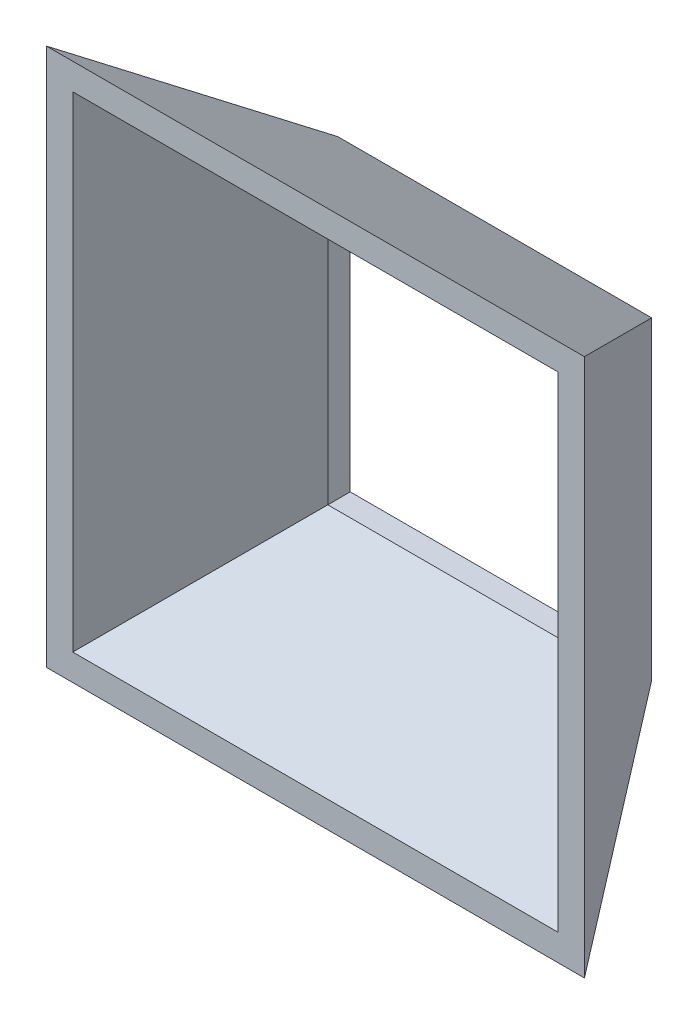
ISO-10303-21;
HEADER;
FILE_DESCRIPTION(('STEP AP214'),'2;1');
FILE_NAME('part.step','',(''),(''),'','','');
FILE_SCHEMA(('AUTOMOTIVE_DESIGN { 1 0 10303 214 1 1 1 1 }'));
ENDSEC;
DATA;
#1=APPLICATION_CONTEXT('core data for automotive mechanical design processes');
#2=APPLICATION_PROTOCOL_DEFINITION('international standard','automotive_design',2000,#1);
#3=PRODUCT_CONTEXT('',#1,'mechanical');
#4=PRODUCT('Part','Part','',(#3));
#5=PRODUCT_RELATED_PRODUCT_CATEGORY('part','',(#4));
#6=PRODUCT_DEFINITION_FORMATION('','',#4);
#7=PRODUCT_DEFINITION_CONTEXT('part definition',#1,'design');
#8=PRODUCT_DEFINITION('design','',#6,#7);
#9=PRODUCT_DEFINITION_SHAPE('','',#8);
#10=(LENGTH_UNIT() NAMED_UNIT(*) SI_UNIT(.MILLI.,.METRE.));
#11=(NAMED_UNIT(*) PLANE_ANGLE_UNIT() SI_UNIT($,.RADIAN.));
#12=(NAMED_UNIT(*) SI_UNIT($,.STERADIAN.) SOLID_ANGLE_UNIT());
#13=UNCERTAINTY_MEASURE_WITH_UNIT(LENGTH_MEASURE(1.E-05),#10,'distance_accuracy_value','');
#14=(GEOMETRIC_REPRESENTATION_CONTEXT(3) GLOBAL_UNCERTAINTY_ASSIGNED_CONTEXT((#13)) GLOBAL_UNIT_ASSIGNED_CONTEXT((#10,
#11,#12)) REPRESENTATION_CONTEXT('',''));
#15=CARTESIAN_POINT('',(0.,0.,0.));
#16=DIRECTION('',(0.,0.,1.));
#17=DIRECTION('',(1.,0.,0.));
#18=AXIS2_PLACEMENT_3D('',#15,#16,#17);
#19=CARTESIAN_POINT('',(0.,0.,50.8));
#20=DIRECTION('',(0.,0.,1.));
#21=DIRECTION('',(1.,0.,0.));
#22=AXIS2_PLACEMENT_3D('',#19,#20,#21);
#23=PLANE('',#22);
#24=DIRECTION('',(0.,-1.,0.));
#25=VECTOR('',#24,1.);
#26=CARTESIAN_POINT('',(-68.7117774764301,0.,50.8));
#27=LINE('',#26,#25);
#28=CARTESIAN_POINT('',(-68.7117774764301,68.7117774764301,50.8));
#29=VERTEX_POINT('',#28);
#30=CARTESIAN_POINT('',(-68.7117774764301,-68.7117774764301,50.8));
#31=VERTEX_POINT('',#30);
#32=EDGE_CURVE('E150',#29,#31,#27,.T.);
#33=ORIENTED_EDGE('',*,*,#32,.F.);
#34=DIRECTION('',(-1.,0.,0.));
#35=VECTOR('',#34,1.);
#36=CARTESIAN_POINT('',(0.,68.7117774764301,50.8));
#37=LINE('',#36,#35);
#38=CARTESIAN_POINT('',(68.7117774764301,68.7117774764301,50.8));
#39=VERTEX_POINT('',#38);
#40=EDGE_CURVE('E158',#39,#29,#37,.T.);
#41=ORIENTED_EDGE('',*,*,#40,.F.);
#42=DIRECTION('',(0.,1.,0.));
#43=VECTOR('',#42,1.);
#44=CARTESIAN_POINT('',(68.7117774764301,0.,50.8));
#45=LINE('',#44,#43);
#46=CARTESIAN_POINT('',(68.7117774764301,-68.71177747643,50.8));
#47=VERTEX_POINT('',#46);
#48=EDGE_CURVE('E66',#47,#39,#45,.T.);
#49=ORIENTED_EDGE('',*,*,#48,.F.);
#50=DIRECTION('',(1.,0.,0.));
#51=VECTOR('',#50,1.);
#52=CARTESIAN_POINT('',(0.,-68.71177747643,50.8));
#53=LINE('',#52,#51);
#54=EDGE_CURVE('E162',#31,#47,#53,.T.);
#55=ORIENTED_EDGE('',*,*,#54,.F.);
#56=EDGE_LOOP('',(#33,#41,#49,#55));
#57=FACE_BOUND('',#56,.T.);
#58=DIRECTION('',(0.,-1.,0.));
#59=VECTOR('',#58,1.);
#60=CARTESIAN_POINT('',(-76.2,76.2,50.8));
#61=LINE('',#60,#59);
#62=CARTESIAN_POINT('',(-76.2,76.2,50.8));
#63=VERTEX_POINT('',#62);
#64=CARTESIAN_POINT('',(-76.2,-76.1999999999999,50.8));
#65=VERTEX_POINT('',#64);
#66=EDGE_CURVE('E212',#63,#65,#61,.T.);
#67=ORIENTED_EDGE('',*,*,#66,.T.);
#68=DIRECTION('',(1.,0.,0.));
#69=VECTOR('',#68,1.);
#70=CARTESIAN_POINT('',(-76.2,-76.2,50.8));
#71=LINE('',#70,#69);
#72=CARTESIAN_POINT('',(76.2,-76.2,50.8));
#73=VERTEX_POINT('',#72);
#74=EDGE_CURVE('E326',#65,#73,#71,.T.);
#75=ORIENTED_EDGE('',*,*,#74,.T.);
#76=DIRECTION('',(0.,1.,0.));
#77=VECTOR('',#76,1.);
#78=CARTESIAN_POINT('',(76.2,76.2,50.8));
#79=LINE('',#78,#77);
#80=CARTESIAN_POINT('',(76.2,76.2,50.8));
#81=VERTEX_POINT('',#80);
#82=EDGE_CURVE('E323',#73,#81,#79,.T.);
#83=ORIENTED_EDGE('',*,*,#82,.T.);
#84=DIRECTION('',(-1.,0.,0.));
#85=VECTOR('',#84,1.);
#86=CARTESIAN_POINT('',(-76.2,76.2,50.8));
#87=LINE('',#86,#85);
#88=EDGE_CURVE('E276',#81,#63,#87,.T.);
#89=ORIENTED_EDGE('',*,*,#88,.T.);
#90=EDGE_LOOP('',(#67,#75,#83,#89));
#91=FACE_BOUND('',#90,.T.);
#92=ADVANCED_FACE('F43',(#57,#91),#23,.T.);
#93=CARTESIAN_POINT('',(0.,0.,0.));
#94=DIRECTION('',(0.,0.,1.));
#95=DIRECTION('',(1.,0.,0.));
#96=AXIS2_PLACEMENT_3D('',#93,#94,#95);
#97=PLANE('',#96);
#98=DIRECTION('',(-1.,0.,0.));
#99=VECTOR('',#98,1.);
#100=CARTESIAN_POINT('',(0.,40.9305274764301,0.));
#101=LINE('',#100,#99);
#102=CARTESIAN_POINT('',(40.9305274764301,40.9305274764301,0.));
#103=VERTEX_POINT('',#102);
#104=CARTESIAN_POINT('',(-40.9305274764301,40.9305274764301,0.));
#105=VERTEX_POINT('',#104);
#106=EDGE_CURVE('E51',#103,#105,#101,.T.);
#107=ORIENTED_EDGE('',*,*,#106,.T.);
#108=DIRECTION('',(0.,-1.,0.));
#109=VECTOR('',#108,1.);
#110=CARTESIAN_POINT('',(-40.9305274764301,0.,0.));
#111=LINE('',#110,#109);
#112=CARTESIAN_POINT('',(-40.9305274764301,-40.9305274764301,0.));
#113=VERTEX_POINT('',#112);
#114=EDGE_CURVE('E12',#105,#113,#111,.T.);
#115=ORIENTED_EDGE('',*,*,#114,.T.);
#116=DIRECTION('',(1.,0.,0.));
#117=VECTOR('',#116,1.);
#118=CARTESIAN_POINT('',(0.,-40.9305274764301,0.));
#119=LINE('',#118,#117);
#120=CARTESIAN_POINT('',(40.9305274764301,-40.9305274764301,0.));
#121=VERTEX_POINT('',#120);
#122=EDGE_CURVE('E126',#113,#121,#119,.T.);
#123=ORIENTED_EDGE('',*,*,#122,.T.);
#124=DIRECTION('',(0.,1.,0.));
#125=VECTOR('',#124,1.);
#126=CARTESIAN_POINT('',(40.9305274764301,0.,0.));
#127=LINE('',#126,#125);
#128=EDGE_CURVE('E349',#121,#103,#127,.T.);
#129=ORIENTED_EDGE('',*,*,#128,.T.);
#130=EDGE_LOOP('',(#107,#115,#123,#129));
#131=FACE_BOUND('',#130,.T.);
#132=DIRECTION('',(0.,-1.,0.));
#133=VECTOR('',#132,1.);
#134=CARTESIAN_POINT('',(-44.45,44.45,0.));
#135=LINE('',#134,#133);
#136=CARTESIAN_POINT('',(-44.45,44.45,0.));
#137=VERTEX_POINT('',#136);
#138=CARTESIAN_POINT('',(-44.45,-44.45,0.));
#139=VERTEX_POINT('',#138);
#140=EDGE_CURVE('E160',#137,#139,#135,.T.);
#141=ORIENTED_EDGE('',*,*,#140,.F.);
#142=DIRECTION('',(-1.,0.,0.));
#143=VECTOR('',#142,1.);
#144=CARTESIAN_POINT('',(-44.45,44.45,0.));
#145=LINE('',#144,#143);
#146=CARTESIAN_POINT('',(44.45,44.45,0.));
#147=VERTEX_POINT('',#146);
#148=EDGE_CURVE('E170',#147,#137,#145,.T.);
#149=ORIENTED_EDGE('',*,*,#148,.F.);
#150=DIRECTION('',(0.,1.,0.));
#151=VECTOR('',#150,1.);
#152=CARTESIAN_POINT('',(44.45,44.45,0.));
#153=LINE('',#152,#151);
#154=CARTESIAN_POINT('',(44.45,-44.45,0.));
#155=VERTEX_POINT('',#154);
#156=EDGE_CURVE('E265',#155,#147,#153,.T.);
#157=ORIENTED_EDGE('',*,*,#156,.F.);
#158=DIRECTION('',(1.,0.,0.));
#159=VECTOR('',#158,1.);
#160=CARTESIAN_POINT('',(-44.45,-44.45,0.));
#161=LINE('',#160,#159);
#162=EDGE_CURVE('E250',#139,#155,#161,.T.);
#163=ORIENTED_EDGE('',*,*,#162,.F.);
#164=EDGE_LOOP('',(#141,#149,#157,#163));
#165=FACE_BOUND('',#164,.T.);
#166=ADVANCED_FACE('F189',(#131,#165),#97,.F.);
#167=CARTESIAN_POINT('',(0.,31.9640449438202,-19.9775280898876));
#168=DIRECTION('',(0.,-0.847998304005088,0.52999894000318));
#169=DIRECTION('',(0.,-0.52999894000318,-0.847998304005088));
#170=AXIS2_PLACEMENT_3D('',#167,#168,#169);
#171=PLANE('',#170);
#172=DIRECTION('',(-0.468292905790847,0.468292905790847,0.749268649265355));
#173=VECTOR('',#172,1.);
#174=CARTESIAN_POINT('',(-44.45,44.45,0.));
#175=LINE('',#174,#173);
#176=EDGE_CURVE('E278',#137,#63,#175,.T.);
#177=ORIENTED_EDGE('',*,*,#176,.T.);
#178=ORIENTED_EDGE('',*,*,#88,.F.);
#179=DIRECTION('',(0.468292905790847,0.468292905790847,0.749268649265355));
#180=VECTOR('',#179,1.);
#181=CARTESIAN_POINT('',(44.45,44.45,0.));
#182=LINE('',#181,#180);
#183=EDGE_CURVE('E176',#147,#81,#182,.T.);
#184=ORIENTED_EDGE('',*,*,#183,.F.);
#185=ORIENTED_EDGE('',*,*,#148,.T.);
#186=EDGE_LOOP('',(#177,#178,#184,#185));
#187=FACE_BOUND('',#186,.T.);
#188=ADVANCED_FACE('F178',(#187),#171,.F.);
#189=CARTESIAN_POINT('',(31.9640449438202,0.,-19.9775280898877));
#190=DIRECTION('',(-0.847998304005088,0.,0.52999894000318));
#191=DIRECTION('',(0.52999894000318,0.,0.847998304005088));
#192=AXIS2_PLACEMENT_3D('',#189,#190,#191);
#193=PLANE('',#192);
#194=ORIENTED_EDGE('',*,*,#183,.T.);
#195=ORIENTED_EDGE('',*,*,#82,.F.);
#196=DIRECTION('',(0.468292905790847,-0.468292905790847,0.749268649265355));
#197=VECTOR('',#196,1.);
#198=CARTESIAN_POINT('',(44.45,-44.45,0.));
#199=LINE('',#198,#197);
#200=EDGE_CURVE('E242',#155,#73,#199,.T.);
#201=ORIENTED_EDGE('',*,*,#200,.F.);
#202=ORIENTED_EDGE('',*,*,#156,.T.);
#203=EDGE_LOOP('',(#194,#195,#201,#202));
#204=FACE_BOUND('',#203,.T.);
#205=ADVANCED_FACE('F188',(#204),#193,.F.);
#206=CARTESIAN_POINT('',(-31.9640449438202,0.,-19.9775280898876));
#207=DIRECTION('',(0.847998304005088,0.,0.52999894000318));
#208=DIRECTION('',(0.52999894000318,0.,-0.847998304005088));
#209=AXIS2_PLACEMENT_3D('',#206,#207,#208);
#210=PLANE('',#209);
#211=DIRECTION('',(-0.468292905790847,-0.468292905790847,0.749268649265355));
#212=VECTOR('',#211,1.);
#213=CARTESIAN_POINT('',(-44.45,-44.45,0.));
#214=LINE('',#213,#212);
#215=EDGE_CURVE('E235',#139,#65,#214,.T.);
#216=ORIENTED_EDGE('',*,*,#215,.T.);
#217=ORIENTED_EDGE('',*,*,#66,.F.);
#218=ORIENTED_EDGE('',*,*,#176,.F.);
#219=ORIENTED_EDGE('',*,*,#140,.T.);
#220=EDGE_LOOP('',(#216,#217,#218,#219));
#221=FACE_BOUND('',#220,.T.);
#222=ADVANCED_FACE('F217',(#221),#210,.F.);
#223=CARTESIAN_POINT('',(0.,-31.9640449438202,-19.9775280898876));
#224=DIRECTION('',(0.,0.847998304005088,0.52999894000318));
#225=DIRECTION('',(0.,-0.52999894000318,0.847998304005088));
#226=AXIS2_PLACEMENT_3D('',#223,#224,#225);
#227=PLANE('',#226);
#228=ORIENTED_EDGE('',*,*,#200,.T.);
#229=ORIENTED_EDGE('',*,*,#74,.F.);
#230=ORIENTED_EDGE('',*,*,#215,.F.);
#231=ORIENTED_EDGE('',*,*,#162,.T.);
#232=EDGE_LOOP('',(#228,#229,#230,#231));
#233=FACE_BOUND('',#232,.T.);
#234=ADVANCED_FACE('F225',(#233),#227,.F.);
#235=CARTESIAN_POINT('',(0.,26.5792557133879,-16.6120348208674));
#236=DIRECTION('',(0.,-0.847998304005088,0.52999894000318));
#237=DIRECTION('',(0.,-0.52999894000318,-0.847998304005088));
#238=AXIS2_PLACEMENT_3D('',#235,#236,#237);
#239=PLANE('',#238);
#240=DIRECTION('',(-0.468292905790847,0.468292905790847,0.749268649265355));
#241=VECTOR('',#240,1.);
#242=CARTESIAN_POINT('',(-20.7504715657151,20.7504715657151,-25.9380894571439));
#243=LINE('',#242,#241);
#244=CARTESIAN_POINT('',(-40.9305274764301,40.9305274764301,6.35));
#245=VERTEX_POINT('',#244);
#246=EDGE_CURVE('E155',#245,#29,#243,.T.);
#247=ORIENTED_EDGE('',*,*,#246,.F.);
#248=DIRECTION('',(-1.,0.,0.));
#249=VECTOR('',#248,1.);
#250=CARTESIAN_POINT('',(0.,40.9305274764301,6.35));
#251=LINE('',#250,#249);
#252=CARTESIAN_POINT('',(40.9305274764301,40.9305274764301,6.35));
#253=VERTEX_POINT('',#252);
#254=EDGE_CURVE('E365',#253,#245,#251,.T.);
#255=ORIENTED_EDGE('',*,*,#254,.F.);
#256=DIRECTION('',(0.468292905790847,0.468292905790847,0.749268649265355));
#257=VECTOR('',#256,1.);
#258=CARTESIAN_POINT('',(20.7504715657151,20.7504715657151,-25.9380894571439));
#259=LINE('',#258,#257);
#260=EDGE_CURVE('E152',#253,#39,#259,.T.);
#261=ORIENTED_EDGE('',*,*,#260,.T.);
#262=ORIENTED_EDGE('',*,*,#40,.T.);
#263=EDGE_LOOP('',(#247,#255,#261,#262));
#264=FACE_BOUND('',#263,.T.);
#265=ADVANCED_FACE('F372',(#264),#239,.T.);
#266=CARTESIAN_POINT('',(26.5792557133879,0.,-16.6120348208675));
#267=DIRECTION('',(-0.847998304005088,0.,0.52999894000318));
#268=DIRECTION('',(0.52999894000318,0.,0.847998304005088));
#269=AXIS2_PLACEMENT_3D('',#266,#267,#268);
#270=PLANE('',#269);
#271=ORIENTED_EDGE('',*,*,#260,.F.);
#272=DIRECTION('',(0.,1.,0.));
#273=VECTOR('',#272,1.);
#274=CARTESIAN_POINT('',(40.9305274764301,0.,6.35));
#275=LINE('',#274,#273);
#276=CARTESIAN_POINT('',(40.9305274764301,-40.9305274764301,6.35));
#277=VERTEX_POINT('',#276);
#278=EDGE_CURVE('E146',#277,#253,#275,.T.);
#279=ORIENTED_EDGE('',*,*,#278,.F.);
#280=DIRECTION('',(0.468292905790847,-0.468292905790847,0.749268649265355));
#281=VECTOR('',#280,1.);
#282=CARTESIAN_POINT('',(20.7504715657151,-20.7504715657151,-25.9380894571439));
#283=LINE('',#282,#281);
#284=EDGE_CURVE('E145',#277,#47,#283,.T.);
#285=ORIENTED_EDGE('',*,*,#284,.T.);
#286=ORIENTED_EDGE('',*,*,#48,.T.);
#287=EDGE_LOOP('',(#271,#279,#285,#286));
#288=FACE_BOUND('',#287,.T.);
#289=ADVANCED_FACE('F373',(#288),#270,.T.);
#290=CARTESIAN_POINT('',(-26.5792557133879,0.,-16.6120348208674));
#291=DIRECTION('',(0.847998304005088,0.,0.52999894000318));
#292=DIRECTION('',(0.52999894000318,0.,-0.847998304005088));
#293=AXIS2_PLACEMENT_3D('',#290,#291,#292);
#294=PLANE('',#293);
#295=DIRECTION('',(-0.468292905790847,-0.468292905790847,0.749268649265355));
#296=VECTOR('',#295,1.);
#297=CARTESIAN_POINT('',(-20.7504715657151,-20.7504715657151,-25.9380894571439));
#298=LINE('',#297,#296);
#299=CARTESIAN_POINT('',(-40.9305274764301,-40.9305274764301,6.35));
#300=VERTEX_POINT('',#299);
#301=EDGE_CURVE('E143',#300,#31,#298,.T.);
#302=ORIENTED_EDGE('',*,*,#301,.F.);
#303=DIRECTION('',(0.,-1.,0.));
#304=VECTOR('',#303,1.);
#305=CARTESIAN_POINT('',(-40.9305274764301,0.,6.35));
#306=LINE('',#305,#304);
#307=EDGE_CURVE('E130',#245,#300,#306,.T.);
#308=ORIENTED_EDGE('',*,*,#307,.F.);
#309=ORIENTED_EDGE('',*,*,#246,.T.);
#310=ORIENTED_EDGE('',*,*,#32,.T.);
#311=EDGE_LOOP('',(#302,#308,#309,#310));
#312=FACE_BOUND('',#311,.T.);
#313=ADVANCED_FACE('F148',(#312),#294,.T.);
#314=CARTESIAN_POINT('',(0.,-26.5792557133879,-16.6120348208674));
#315=DIRECTION('',(0.,0.847998304005088,0.52999894000318));
#316=DIRECTION('',(0.,-0.52999894000318,0.847998304005088));
#317=AXIS2_PLACEMENT_3D('',#314,#315,#316);
#318=PLANE('',#317);
#319=ORIENTED_EDGE('',*,*,#284,.F.);
#320=DIRECTION('',(1.,0.,0.));
#321=VECTOR('',#320,1.);
#322=CARTESIAN_POINT('',(0.,-40.9305274764301,6.35));
#323=LINE('',#322,#321);
#324=EDGE_CURVE('E123',#300,#277,#323,.T.);
#325=ORIENTED_EDGE('',*,*,#324,.F.);
#326=ORIENTED_EDGE('',*,*,#301,.T.);
#327=ORIENTED_EDGE('',*,*,#54,.T.);
#328=EDGE_LOOP('',(#319,#325,#326,#327));
#329=FACE_BOUND('',#328,.T.);
#330=ADVANCED_FACE('F141',(#329),#318,.T.);
#331=CARTESIAN_POINT('',(-40.9305274764301,-40.9305274764301,-0.000100000000003743));
#332=DIRECTION('',(-1.,0.,0.));
#333=DIRECTION('',(0.,0.,1.));
#334=AXIS2_PLACEMENT_3D('',#331,#332,#333);
#335=PLANE('',#334);
#336=DIRECTION('',(0.,0.,1.));
#337=VECTOR('',#336,1.);
#338=CARTESIAN_POINT('',(-40.9305274764301,40.9305274764301,-0.000100000000003743));
#339=LINE('',#338,#337);
#340=EDGE_CURVE('E133',#105,#245,#339,.T.);
#341=ORIENTED_EDGE('',*,*,#340,.T.);
#342=ORIENTED_EDGE('',*,*,#307,.T.);
#343=DIRECTION('',(0.,0.,1.));
#344=VECTOR('',#343,1.);
#345=CARTESIAN_POINT('',(-40.9305274764301,-40.9305274764301,-0.000100000000003743));
#346=LINE('',#345,#344);
#347=EDGE_CURVE('E119',#113,#300,#346,.T.);
#348=ORIENTED_EDGE('',*,*,#347,.F.);
#349=ORIENTED_EDGE('',*,*,#114,.F.);
#350=EDGE_LOOP('',(#341,#342,#348,#349));
#351=FACE_BOUND('',#350,.T.);
#352=ADVANCED_FACE('F131',(#351),#335,.F.);
#353=CARTESIAN_POINT('',(-40.9305274764301,40.9305274764301,-0.000100000000003743));
#354=DIRECTION('',(0.,1.,0.));
#355=DIRECTION('',(0.,0.,1.));
#356=AXIS2_PLACEMENT_3D('',#353,#354,#355);
#357=PLANE('',#356);
#358=DIRECTION('',(0.,0.,1.));
#359=VECTOR('',#358,1.);
#360=CARTESIAN_POINT('',(40.9305274764301,40.9305274764301,-0.000100000000003743));
#361=LINE('',#360,#359);
#362=EDGE_CURVE('E357',#103,#253,#361,.T.);
#363=ORIENTED_EDGE('',*,*,#362,.T.);
#364=ORIENTED_EDGE('',*,*,#254,.T.);
#365=ORIENTED_EDGE('',*,*,#340,.F.);
#366=ORIENTED_EDGE('',*,*,#106,.F.);
#367=EDGE_LOOP('',(#363,#364,#365,#366));
#368=FACE_BOUND('',#367,.T.);
#369=ADVANCED_FACE('F356',(#368),#357,.F.);
#370=CARTESIAN_POINT('',(40.9305274764301,-40.9305274764301,-0.000100000000003743));
#371=DIRECTION('',(1.,0.,0.));
#372=DIRECTION('',(0.,0.,-1.));
#373=AXIS2_PLACEMENT_3D('',#370,#371,#372);
#374=PLANE('',#373);
#375=DIRECTION('',(0.,0.,1.));
#376=VECTOR('',#375,1.);
#377=CARTESIAN_POINT('',(40.9305274764301,-40.9305274764301,-0.000100000000003743));
#378=LINE('',#377,#376);
#379=EDGE_CURVE('E58',#121,#277,#378,.T.);
#380=ORIENTED_EDGE('',*,*,#379,.T.);
#381=ORIENTED_EDGE('',*,*,#278,.T.);
#382=ORIENTED_EDGE('',*,*,#362,.F.);
#383=ORIENTED_EDGE('',*,*,#128,.F.);
#384=EDGE_LOOP('',(#380,#381,#382,#383));
#385=FACE_BOUND('',#384,.T.);
#386=ADVANCED_FACE('F360',(#385),#374,.F.);
#387=CARTESIAN_POINT('',(-40.9305274764301,-40.9305274764301,-0.000100000000003743));
#388=DIRECTION('',(0.,-1.,0.));
#389=DIRECTION('',(0.,0.,-1.));
#390=AXIS2_PLACEMENT_3D('',#387,#388,#389);
#391=PLANE('',#390);
#392=ORIENTED_EDGE('',*,*,#347,.T.);
#393=ORIENTED_EDGE('',*,*,#324,.T.);
#394=ORIENTED_EDGE('',*,*,#379,.F.);
#395=ORIENTED_EDGE('',*,*,#122,.F.);
#396=EDGE_LOOP('',(#392,#393,#394,#395));
#397=FACE_BOUND('',#396,.T.);
#398=ADVANCED_FACE('F121',(#397),#391,.F.);
#399=CLOSED_SHELL('',(#92,#166,#188,#205,#222,#234,#265,#289,#313,#330,#352,#369,#386,#398));
#400=MANIFOLD_SOLID_BREP('B2',#399);
#401=ADVANCED_BREP_SHAPE_REPRESENTATION('',(#18,#400),#14);
#402=SHAPE_DEFINITION_REPRESENTATION(#9,#401);
ENDSEC;
END-ISO-10303-21;
